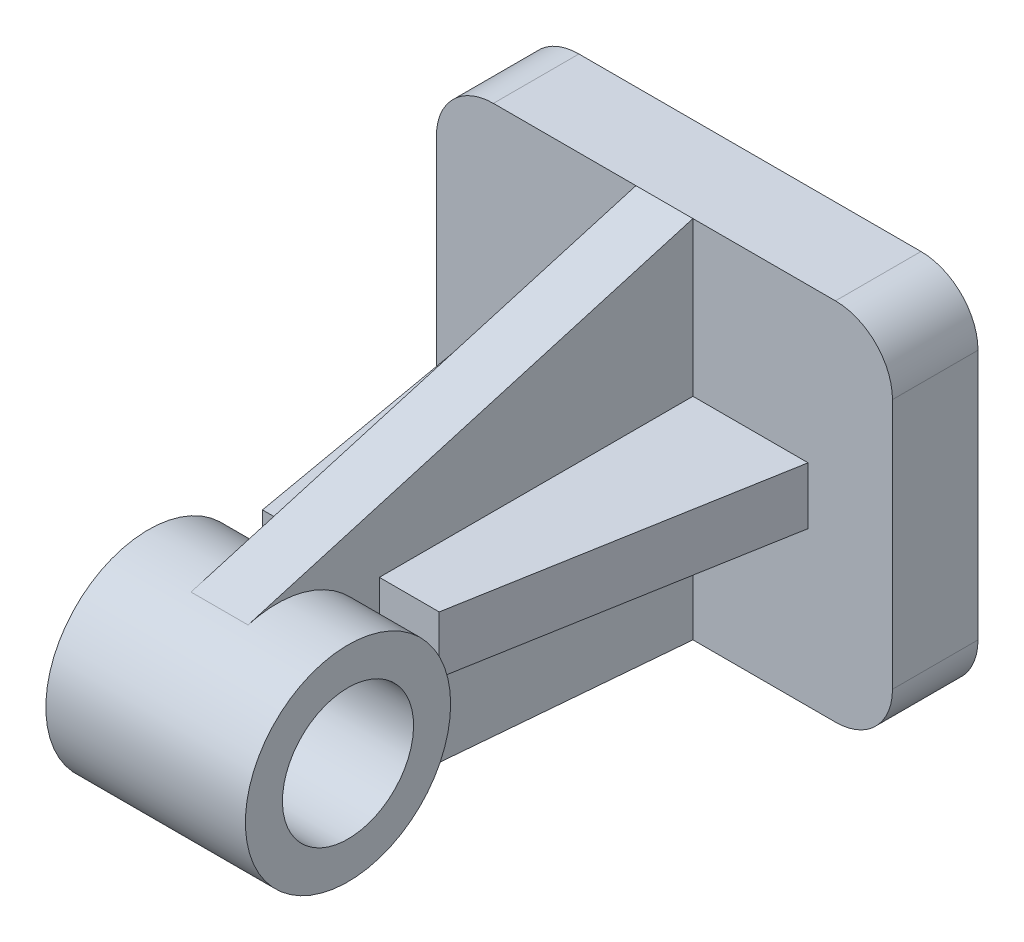
ISO-10303-21;
HEADER;
FILE_DESCRIPTION(('STEP AP214'),'2;1');
FILE_NAME('part.step','',(''),(''),'','','');
FILE_SCHEMA(('AUTOMOTIVE_DESIGN { 1 0 10303 214 1 1 1 1 }'));
ENDSEC;
DATA;
#1=APPLICATION_CONTEXT('core data for automotive mechanical design processes');
#2=APPLICATION_PROTOCOL_DEFINITION('international standard','automotive_design',2000,#1);
#3=PRODUCT_CONTEXT('',#1,'mechanical');
#4=PRODUCT('Part','Part','',(#3));
#5=PRODUCT_RELATED_PRODUCT_CATEGORY('part','',(#4));
#6=PRODUCT_DEFINITION_FORMATION('','',#4);
#7=PRODUCT_DEFINITION_CONTEXT('part definition',#1,'design');
#8=PRODUCT_DEFINITION('design','',#6,#7);
#9=PRODUCT_DEFINITION_SHAPE('','',#8);
#10=(LENGTH_UNIT() NAMED_UNIT(*) SI_UNIT(.MILLI.,.METRE.));
#11=(NAMED_UNIT(*) PLANE_ANGLE_UNIT() SI_UNIT($,.RADIAN.));
#12=(NAMED_UNIT(*) SI_UNIT($,.STERADIAN.) SOLID_ANGLE_UNIT());
#13=UNCERTAINTY_MEASURE_WITH_UNIT(LENGTH_MEASURE(1.E-05),#10,'distance_accuracy_value','');
#14=(GEOMETRIC_REPRESENTATION_CONTEXT(3) GLOBAL_UNCERTAINTY_ASSIGNED_CONTEXT((#13)) GLOBAL_UNIT_ASSIGNED_CONTEXT((#10,
#11,#12)) REPRESENTATION_CONTEXT('',''));
#15=CARTESIAN_POINT('',(0.,0.,0.));
#16=DIRECTION('',(0.,0.,1.));
#17=DIRECTION('',(1.,0.,0.));
#18=AXIS2_PLACEMENT_3D('',#15,#16,#17);
#19=CARTESIAN_POINT('',(0.,0.,15.));
#20=DIRECTION('',(0.,0.,1.));
#21=DIRECTION('',(1.,0.,0.));
#22=AXIS2_PLACEMENT_3D('',#19,#20,#21);
#23=PLANE('',#22);
#24=DIRECTION('',(0.,-1.,0.));
#25=VECTOR('',#24,1.);
#26=CARTESIAN_POINT('',(25.1979839389654,5.,15.));
#27=LINE('',#26,#25);
#28=CARTESIAN_POINT('',(25.1979839389654,5.,15.));
#29=VERTEX_POINT('',#28);
#30=CARTESIAN_POINT('',(25.1979839389654,-5.,15.));
#31=VERTEX_POINT('',#30);
#32=EDGE_CURVE('E69',#29,#31,#27,.T.);
#33=ORIENTED_EDGE('',*,*,#32,.T.);
#34=DIRECTION('',(-1.,0.,0.));
#35=VECTOR('',#34,1.);
#36=CARTESIAN_POINT('',(-25.1979839389654,-5.,15.));
#37=LINE('',#36,#35);
#38=CARTESIAN_POINT('',(5.,-5.,15.));
#39=VERTEX_POINT('',#38);
#40=EDGE_CURVE('E676',#31,#39,#37,.T.);
#41=ORIENTED_EDGE('',*,*,#40,.T.);
#42=DIRECTION('',(0.,-1.,0.));
#43=VECTOR('',#42,1.);
#44=CARTESIAN_POINT('',(5.,0.,15.));
#45=LINE('',#44,#43);
#46=CARTESIAN_POINT('',(5.,-32.,15.));
#47=VERTEX_POINT('',#46);
#48=EDGE_CURVE('E254',#39,#47,#45,.T.);
#49=ORIENTED_EDGE('',*,*,#48,.T.);
#50=DIRECTION('',(1.,0.,0.));
#51=VECTOR('',#50,1.);
#52=CARTESIAN_POINT('',(-40.,-32.,15.));
#53=LINE('',#52,#51);
#54=CARTESIAN_POINT('',(30.,-32.,15.));
#55=VERTEX_POINT('',#54);
#56=EDGE_CURVE('E305',#47,#55,#53,.T.);
#57=ORIENTED_EDGE('',*,*,#56,.T.);
#58=CARTESIAN_POINT('',(30.,-22.,15.));
#59=DIRECTION('',(0.,0.,1.));
#60=DIRECTION('',(1.,0.,0.));
#61=AXIS2_PLACEMENT_3D('',#58,#59,#60);
#62=CIRCLE('',#61,10.);
#63=CARTESIAN_POINT('',(40.,-22.,15.));
#64=VERTEX_POINT('',#63);
#65=EDGE_CURVE('E352',#55,#64,#62,.T.);
#66=ORIENTED_EDGE('',*,*,#65,.T.);
#67=DIRECTION('',(0.,1.,0.));
#68=VECTOR('',#67,1.);
#69=CARTESIAN_POINT('',(40.,-32.,15.));
#70=LINE('',#69,#68);
#71=CARTESIAN_POINT('',(40.,22.,15.));
#72=VERTEX_POINT('',#71);
#73=EDGE_CURVE('E307',#64,#72,#70,.T.);
#74=ORIENTED_EDGE('',*,*,#73,.T.);
#75=CARTESIAN_POINT('',(30.,22.,15.));
#76=DIRECTION('',(0.,0.,1.));
#77=DIRECTION('',(1.,0.,0.));
#78=AXIS2_PLACEMENT_3D('',#75,#76,#77);
#79=CIRCLE('',#78,10.);
#80=CARTESIAN_POINT('',(30.,32.,15.));
#81=VERTEX_POINT('',#80);
#82=EDGE_CURVE('E362',#72,#81,#79,.T.);
#83=ORIENTED_EDGE('',*,*,#82,.T.);
#84=DIRECTION('',(-1.,0.,0.));
#85=VECTOR('',#84,1.);
#86=CARTESIAN_POINT('',(-40.,32.,15.));
#87=LINE('',#86,#85);
#88=CARTESIAN_POINT('',(5.,32.,15.));
#89=VERTEX_POINT('',#88);
#90=EDGE_CURVE('E291',#81,#89,#87,.T.);
#91=ORIENTED_EDGE('',*,*,#90,.T.);
#92=CARTESIAN_POINT('',(5.,5.,15.));
#93=VERTEX_POINT('',#92);
#94=EDGE_CURVE('E258',#89,#93,#45,.T.);
#95=ORIENTED_EDGE('',*,*,#94,.T.);
#96=DIRECTION('',(-1.,0.,0.));
#97=VECTOR('',#96,1.);
#98=CARTESIAN_POINT('',(-25.1979839389654,5.,15.));
#99=LINE('',#98,#97);
#100=EDGE_CURVE('E74',#29,#93,#99,.T.);
#101=ORIENTED_EDGE('',*,*,#100,.F.);
#102=EDGE_LOOP('',(#33,#41,#49,#57,#66,#74,#83,#91,#95,#101));
#103=FACE_BOUND('',#102,.T.);
#104=ADVANCED_FACE('F52',(#103),#23,.T.);
#105=DIRECTION('',(0.,-1.,0.));
#106=VECTOR('',#105,1.);
#107=CARTESIAN_POINT('',(-5.,0.,15.));
#108=LINE('',#107,#106);
#109=CARTESIAN_POINT('',(-5.,-5.,15.));
#110=VERTEX_POINT('',#109);
#111=CARTESIAN_POINT('',(-5.,-32.,15.));
#112=VERTEX_POINT('',#111);
#113=EDGE_CURVE('E271',#110,#112,#108,.T.);
#114=ORIENTED_EDGE('',*,*,#113,.F.);
#115=CARTESIAN_POINT('',(-25.1979839389654,-5.,15.));
#116=VERTEX_POINT('',#115);
#117=EDGE_CURVE('E680',#110,#116,#37,.T.);
#118=ORIENTED_EDGE('',*,*,#117,.T.);
#119=DIRECTION('',(0.,-1.,0.));
#120=VECTOR('',#119,1.);
#121=CARTESIAN_POINT('',(-25.1979839389654,5.,15.));
#122=LINE('',#121,#120);
#123=CARTESIAN_POINT('',(-25.1979839389654,5.,15.));
#124=VERTEX_POINT('',#123);
#125=EDGE_CURVE('E222',#124,#116,#122,.T.);
#126=ORIENTED_EDGE('',*,*,#125,.F.);
#127=CARTESIAN_POINT('',(-5.,5.,15.));
#128=VERTEX_POINT('',#127);
#129=EDGE_CURVE('E208',#128,#124,#99,.T.);
#130=ORIENTED_EDGE('',*,*,#129,.F.);
#131=CARTESIAN_POINT('',(-5.,32.,15.));
#132=VERTEX_POINT('',#131);
#133=EDGE_CURVE('E275',#132,#128,#108,.T.);
#134=ORIENTED_EDGE('',*,*,#133,.F.);
#135=CARTESIAN_POINT('',(-30.,32.,15.));
#136=VERTEX_POINT('',#135);
#137=EDGE_CURVE('E297',#132,#136,#87,.T.);
#138=ORIENTED_EDGE('',*,*,#137,.T.);
#139=CARTESIAN_POINT('',(-30.,22.,15.));
#140=DIRECTION('',(0.,0.,1.));
#141=DIRECTION('',(1.,0.,0.));
#142=AXIS2_PLACEMENT_3D('',#139,#140,#141);
#143=CIRCLE('',#142,10.);
#144=CARTESIAN_POINT('',(-40.,22.,15.));
#145=VERTEX_POINT('',#144);
#146=EDGE_CURVE('E358',#136,#145,#143,.T.);
#147=ORIENTED_EDGE('',*,*,#146,.T.);
#148=DIRECTION('',(0.,-1.,0.));
#149=VECTOR('',#148,1.);
#150=CARTESIAN_POINT('',(-40.,-32.,15.));
#151=LINE('',#150,#149);
#152=CARTESIAN_POINT('',(-40.,-22.,15.));
#153=VERTEX_POINT('',#152);
#154=EDGE_CURVE('E300',#145,#153,#151,.T.);
#155=ORIENTED_EDGE('',*,*,#154,.T.);
#156=CARTESIAN_POINT('',(-30.,-22.,15.));
#157=DIRECTION('',(0.,0.,1.));
#158=DIRECTION('',(1.,0.,0.));
#159=AXIS2_PLACEMENT_3D('',#156,#157,#158);
#160=CIRCLE('',#159,10.);
#161=CARTESIAN_POINT('',(-30.,-32.,15.));
#162=VERTEX_POINT('',#161);
#163=EDGE_CURVE('E359',#153,#162,#160,.T.);
#164=ORIENTED_EDGE('',*,*,#163,.T.);
#165=EDGE_CURVE('E301',#162,#112,#53,.T.);
#166=ORIENTED_EDGE('',*,*,#165,.T.);
#167=EDGE_LOOP('',(#114,#118,#126,#130,#134,#138,#147,#155,#164,#166));
#168=FACE_BOUND('',#167,.T.);
#169=ADVANCED_FACE('F407',(#168),#23,.T.);
#170=CARTESIAN_POINT('',(5.,0.,0.));
#171=DIRECTION('',(1.,0.,0.));
#172=DIRECTION('',(0.,0.,-1.));
#173=AXIS2_PLACEMENT_3D('',#170,#171,#172);
#174=PLANE('',#173);
#175=DIRECTION('',(0.,1.,0.));
#176=VECTOR('',#175,1.);
#177=CARTESIAN_POINT('',(5.,0.,70.));
#178=LINE('',#177,#176);
#179=CARTESIAN_POINT('',(5.,-5.,70.));
#180=VERTEX_POINT('',#179);
#181=CARTESIAN_POINT('',(5.,5.,70.));
#182=VERTEX_POINT('',#181);
#183=EDGE_CURVE('E230',#180,#182,#178,.T.);
#184=ORIENTED_EDGE('',*,*,#183,.T.);
#185=DIRECTION('',(0.,0.,-1.));
#186=VECTOR('',#185,1.);
#187=CARTESIAN_POINT('',(5.,5.,0.));
#188=LINE('',#187,#186);
#189=EDGE_CURVE('E192',#182,#93,#188,.T.);
#190=ORIENTED_EDGE('',*,*,#189,.T.);
#191=ORIENTED_EDGE('',*,*,#94,.F.);
#192=DIRECTION('',(0.,0.279527499455133,-0.960137686505618));
#193=VECTOR('',#192,1.);
#194=CARTESIAN_POINT('',(5.,33.5254333651708,9.76035071680426));
#195=LINE('',#194,#193);
#196=CARTESIAN_POINT('',(5.,9.28247835710112,93.0314949901924));
#197=VERTEX_POINT('',#196);
#198=EDGE_CURVE('E259',#197,#89,#195,.T.);
#199=ORIENTED_EDGE('',*,*,#198,.F.);
#200=CARTESIAN_POINT('',(5.,-8.,88.));
#201=DIRECTION('',(1.,0.,0.));
#202=DIRECTION('',(0.,0.,-1.));
#203=AXIS2_PLACEMENT_3D('',#200,#201,#202);
#204=CIRCLE('',#203,18.);
#205=CARTESIAN_POINT('',(5.,-25.940694883688,89.4599544823084));
#206=VERTEX_POINT('',#205);
#207=EDGE_CURVE('E250',#206,#197,#204,.T.);
#208=ORIENTED_EDGE('',*,*,#207,.F.);
#209=DIRECTION('',(0.,0.0811085823504653,0.996705271315998));
#210=VECTOR('',#209,1.);
#211=CARTESIAN_POINT('',(5.,-33.0021050054763,2.68560228244918));
#212=LINE('',#211,#210);
#213=EDGE_CURVE('E247',#47,#206,#212,.T.);
#214=ORIENTED_EDGE('',*,*,#213,.F.);
#215=ORIENTED_EDGE('',*,*,#48,.F.);
#216=DIRECTION('',(0.,0.,-1.));
#217=VECTOR('',#216,1.);
#218=CARTESIAN_POINT('',(5.,-5.,0.));
#219=LINE('',#218,#217);
#220=EDGE_CURVE('E214',#180,#39,#219,.T.);
#221=ORIENTED_EDGE('',*,*,#220,.F.);
#222=EDGE_LOOP('',(#184,#190,#191,#199,#208,#214,#215,#221));
#223=FACE_BOUND('',#222,.T.);
#224=ADVANCED_FACE('F472',(#223),#174,.T.);
#225=CARTESIAN_POINT('',(-5.,0.,0.));
#226=DIRECTION('',(1.,0.,0.));
#227=DIRECTION('',(0.,0.,-1.));
#228=AXIS2_PLACEMENT_3D('',#225,#226,#227);
#229=PLANE('',#228);
#230=DIRECTION('',(0.,0.,-1.));
#231=VECTOR('',#230,1.);
#232=CARTESIAN_POINT('',(-5.,5.,0.));
#233=LINE('',#232,#231);
#234=CARTESIAN_POINT('',(-5.,5.,70.));
#235=VERTEX_POINT('',#234);
#236=EDGE_CURVE('E12',#235,#128,#233,.T.);
#237=ORIENTED_EDGE('',*,*,#236,.F.);
#238=DIRECTION('',(0.,1.,0.));
#239=VECTOR('',#238,1.);
#240=CARTESIAN_POINT('',(-5.,0.,70.));
#241=LINE('',#240,#239);
#242=CARTESIAN_POINT('',(-5.,-5.,70.));
#243=VERTEX_POINT('',#242);
#244=EDGE_CURVE('E65',#243,#235,#241,.T.);
#245=ORIENTED_EDGE('',*,*,#244,.F.);
#246=DIRECTION('',(0.,0.,-1.));
#247=VECTOR('',#246,1.);
#248=CARTESIAN_POINT('',(-5.,-5.,0.));
#249=LINE('',#248,#247);
#250=EDGE_CURVE('E379',#243,#110,#249,.T.);
#251=ORIENTED_EDGE('',*,*,#250,.T.);
#252=ORIENTED_EDGE('',*,*,#113,.T.);
#253=DIRECTION('',(0.,0.0811085823504653,0.996705271315998));
#254=VECTOR('',#253,1.);
#255=CARTESIAN_POINT('',(-5.,-33.0021050054763,2.68560228244918));
#256=LINE('',#255,#254);
#257=CARTESIAN_POINT('',(-5.,-25.940694883688,89.4599544823084));
#258=VERTEX_POINT('',#257);
#259=EDGE_CURVE('E270',#112,#258,#256,.T.);
#260=ORIENTED_EDGE('',*,*,#259,.T.);
#261=CARTESIAN_POINT('',(-5.,-8.,88.));
#262=DIRECTION('',(1.,0.,0.));
#263=DIRECTION('',(0.,0.,-1.));
#264=AXIS2_PLACEMENT_3D('',#261,#262,#263);
#265=CIRCLE('',#264,18.);
#266=CARTESIAN_POINT('',(-5.,9.28247835710112,93.0314949901924));
#267=VERTEX_POINT('',#266);
#268=EDGE_CURVE('E242',#258,#267,#265,.T.);
#269=ORIENTED_EDGE('',*,*,#268,.T.);
#270=DIRECTION('',(0.,0.279527499455133,-0.960137686505618));
#271=VECTOR('',#270,1.);
#272=CARTESIAN_POINT('',(-5.,33.5254333651708,9.76035071680426));
#273=LINE('',#272,#271);
#274=EDGE_CURVE('E253',#267,#132,#273,.T.);
#275=ORIENTED_EDGE('',*,*,#274,.T.);
#276=ORIENTED_EDGE('',*,*,#133,.T.);
#277=EDGE_LOOP('',(#237,#245,#251,#252,#260,#269,#275,#276));
#278=FACE_BOUND('',#277,.T.);
#279=ADVANCED_FACE('F405',(#278),#229,.F.);
#280=CARTESIAN_POINT('',(-40.,32.,15.));
#281=DIRECTION('',(0.,-1.,0.));
#282=DIRECTION('',(0.,0.,-1.));
#283=AXIS2_PLACEMENT_3D('',#280,#281,#282);
#284=PLANE('',#283);
#285=ORIENTED_EDGE('',*,*,#90,.F.);
#286=DIRECTION('',(0.,0.,-1.));
#287=VECTOR('',#286,1.);
#288=CARTESIAN_POINT('',(30.,32.,15.));
#289=LINE('',#288,#287);
#290=CARTESIAN_POINT('',(30.,32.,0.));
#291=VERTEX_POINT('',#290);
#292=EDGE_CURVE('E329',#81,#291,#289,.T.);
#293=ORIENTED_EDGE('',*,*,#292,.T.);
#294=DIRECTION('',(-1.,0.,0.));
#295=VECTOR('',#294,1.);
#296=CARTESIAN_POINT('',(-40.,32.,0.));
#297=LINE('',#296,#295);
#298=CARTESIAN_POINT('',(-30.,32.,0.));
#299=VERTEX_POINT('',#298);
#300=EDGE_CURVE('E295',#291,#299,#297,.T.);
#301=ORIENTED_EDGE('',*,*,#300,.T.);
#302=DIRECTION('',(0.,0.,-1.));
#303=VECTOR('',#302,1.);
#304=CARTESIAN_POINT('',(-30.,32.,15.));
#305=LINE('',#304,#303);
#306=EDGE_CURVE('E313',#299,#136,#305,.F.);
#307=ORIENTED_EDGE('',*,*,#306,.T.);
#308=ORIENTED_EDGE('',*,*,#137,.F.);
#309=DIRECTION('',(-1.,0.,0.));
#310=VECTOR('',#309,1.);
#311=CARTESIAN_POINT('',(5.,32.,15.));
#312=LINE('',#311,#310);
#313=EDGE_CURVE('E281',#89,#132,#312,.T.);
#314=ORIENTED_EDGE('',*,*,#313,.F.);
#315=EDGE_LOOP('',(#285,#293,#301,#307,#308,#314));
#316=FACE_BOUND('',#315,.T.);
#317=ADVANCED_FACE('F411',(#316),#284,.F.);
#318=CARTESIAN_POINT('',(-40.,-32.,15.));
#319=DIRECTION('',(1.,0.,0.));
#320=DIRECTION('',(0.,0.,-1.));
#321=AXIS2_PLACEMENT_3D('',#318,#319,#320);
#322=PLANE('',#321);
#323=DIRECTION('',(0.,-1.,0.));
#324=VECTOR('',#323,1.);
#325=CARTESIAN_POINT('',(-40.,-32.,0.));
#326=LINE('',#325,#324);
#327=CARTESIAN_POINT('',(-40.,22.,0.));
#328=VERTEX_POINT('',#327);
#329=CARTESIAN_POINT('',(-40.,-22.,0.));
#330=VERTEX_POINT('',#329);
#331=EDGE_CURVE('E312',#328,#330,#326,.T.);
#332=ORIENTED_EDGE('',*,*,#331,.T.);
#333=DIRECTION('',(0.,0.,-1.));
#334=VECTOR('',#333,1.);
#335=CARTESIAN_POINT('',(-40.,-22.,15.));
#336=LINE('',#335,#334);
#337=EDGE_CURVE('E380',#330,#153,#336,.F.);
#338=ORIENTED_EDGE('',*,*,#337,.T.);
#339=ORIENTED_EDGE('',*,*,#154,.F.);
#340=DIRECTION('',(0.,0.,-1.));
#341=VECTOR('',#340,1.);
#342=CARTESIAN_POINT('',(-40.,22.,15.));
#343=LINE('',#342,#341);
#344=EDGE_CURVE('E373',#145,#328,#343,.T.);
#345=ORIENTED_EDGE('',*,*,#344,.T.);
#346=EDGE_LOOP('',(#332,#338,#339,#345));
#347=FACE_BOUND('',#346,.T.);
#348=ADVANCED_FACE('F457',(#347),#322,.F.);
#349=CARTESIAN_POINT('',(-40.,-32.,15.));
#350=DIRECTION('',(0.,1.,0.));
#351=DIRECTION('',(0.,0.,1.));
#352=AXIS2_PLACEMENT_3D('',#349,#350,#351);
#353=PLANE('',#352);
#354=ORIENTED_EDGE('',*,*,#165,.F.);
#355=DIRECTION('',(0.,0.,-1.));
#356=VECTOR('',#355,1.);
#357=CARTESIAN_POINT('',(-30.,-32.,15.));
#358=LINE('',#357,#356);
#359=CARTESIAN_POINT('',(-30.,-32.,0.));
#360=VERTEX_POINT('',#359);
#361=EDGE_CURVE('E369',#162,#360,#358,.T.);
#362=ORIENTED_EDGE('',*,*,#361,.T.);
#363=DIRECTION('',(1.,0.,0.));
#364=VECTOR('',#363,1.);
#365=CARTESIAN_POINT('',(-40.,-32.,0.));
#366=LINE('',#365,#364);
#367=CARTESIAN_POINT('',(30.,-32.,0.));
#368=VERTEX_POINT('',#367);
#369=EDGE_CURVE('E317',#360,#368,#366,.T.);
#370=ORIENTED_EDGE('',*,*,#369,.T.);
#371=DIRECTION('',(0.,0.,-1.));
#372=VECTOR('',#371,1.);
#373=CARTESIAN_POINT('',(30.,-32.,15.));
#374=LINE('',#373,#372);
#375=EDGE_CURVE('E364',#368,#55,#374,.F.);
#376=ORIENTED_EDGE('',*,*,#375,.T.);
#377=ORIENTED_EDGE('',*,*,#56,.F.);
#378=DIRECTION('',(-1.,0.,0.));
#379=VECTOR('',#378,1.);
#380=CARTESIAN_POINT('',(5.,-32.,15.));
#381=LINE('',#380,#379);
#382=EDGE_CURVE('E283',#47,#112,#381,.T.);
#383=ORIENTED_EDGE('',*,*,#382,.T.);
#384=EDGE_LOOP('',(#354,#362,#370,#376,#377,#383));
#385=FACE_BOUND('',#384,.T.);
#386=ADVANCED_FACE('F430',(#385),#353,.F.);
#387=CARTESIAN_POINT('',(40.,-32.,15.));
#388=DIRECTION('',(-1.,0.,0.));
#389=DIRECTION('',(0.,0.,1.));
#390=AXIS2_PLACEMENT_3D('',#387,#388,#389);
#391=PLANE('',#390);
#392=DIRECTION('',(0.,1.,0.));
#393=VECTOR('',#392,1.);
#394=CARTESIAN_POINT('',(40.,-32.,0.));
#395=LINE('',#394,#393);
#396=CARTESIAN_POINT('',(40.,-22.,0.));
#397=VERTEX_POINT('',#396);
#398=CARTESIAN_POINT('',(40.,22.,0.));
#399=VERTEX_POINT('',#398);
#400=EDGE_CURVE('E323',#397,#399,#395,.T.);
#401=ORIENTED_EDGE('',*,*,#400,.T.);
#402=DIRECTION('',(0.,0.,-1.));
#403=VECTOR('',#402,1.);
#404=CARTESIAN_POINT('',(40.,22.,15.));
#405=LINE('',#404,#403);
#406=EDGE_CURVE('E348',#399,#72,#405,.F.);
#407=ORIENTED_EDGE('',*,*,#406,.T.);
#408=ORIENTED_EDGE('',*,*,#73,.F.);
#409=DIRECTION('',(0.,0.,-1.));
#410=VECTOR('',#409,1.);
#411=CARTESIAN_POINT('',(40.,-22.,15.));
#412=LINE('',#411,#410);
#413=EDGE_CURVE('E347',#64,#397,#412,.T.);
#414=ORIENTED_EDGE('',*,*,#413,.T.);
#415=EDGE_LOOP('',(#401,#407,#408,#414));
#416=FACE_BOUND('',#415,.T.);
#417=ADVANCED_FACE('F446',(#416),#391,.F.);
#418=CARTESIAN_POINT('',(0.,0.,0.));
#419=DIRECTION('',(0.,0.,1.));
#420=DIRECTION('',(1.,0.,0.));
#421=AXIS2_PLACEMENT_3D('',#418,#419,#420);
#422=PLANE('',#421);
#423=ORIENTED_EDGE('',*,*,#300,.F.);
#424=CARTESIAN_POINT('',(30.,22.,0.));
#425=DIRECTION('',(0.,0.,1.));
#426=DIRECTION('',(1.,0.,0.));
#427=AXIS2_PLACEMENT_3D('',#424,#425,#426);
#428=CIRCLE('',#427,10.);
#429=EDGE_CURVE('E341',#291,#399,#428,.F.);
#430=ORIENTED_EDGE('',*,*,#429,.T.);
#431=ORIENTED_EDGE('',*,*,#400,.F.);
#432=CARTESIAN_POINT('',(30.,-22.,0.));
#433=DIRECTION('',(0.,0.,1.));
#434=DIRECTION('',(1.,0.,0.));
#435=AXIS2_PLACEMENT_3D('',#432,#433,#434);
#436=CIRCLE('',#435,10.);
#437=EDGE_CURVE('E331',#397,#368,#436,.F.);
#438=ORIENTED_EDGE('',*,*,#437,.T.);
#439=ORIENTED_EDGE('',*,*,#369,.F.);
#440=CARTESIAN_POINT('',(-30.,-22.,0.));
#441=DIRECTION('',(0.,0.,1.));
#442=DIRECTION('',(1.,0.,0.));
#443=AXIS2_PLACEMENT_3D('',#440,#441,#442);
#444=CIRCLE('',#443,10.);
#445=EDGE_CURVE('E339',#360,#330,#444,.F.);
#446=ORIENTED_EDGE('',*,*,#445,.T.);
#447=ORIENTED_EDGE('',*,*,#331,.F.);
#448=CARTESIAN_POINT('',(-30.,22.,0.));
#449=DIRECTION('',(0.,0.,1.));
#450=DIRECTION('',(1.,0.,0.));
#451=AXIS2_PLACEMENT_3D('',#448,#449,#450);
#452=CIRCLE('',#451,10.);
#453=EDGE_CURVE('E340',#328,#299,#452,.F.);
#454=ORIENTED_EDGE('',*,*,#453,.T.);
#455=EDGE_LOOP('',(#423,#430,#431,#438,#439,#446,#447,#454));
#456=FACE_BOUND('',#455,.T.);
#457=ADVANCED_FACE('F437',(#456),#422,.F.);
#458=CARTESIAN_POINT('',(30.,22.,15.));
#459=DIRECTION('',(0.,0.,-1.));
#460=DIRECTION('',(-1.,0.,0.));
#461=AXIS2_PLACEMENT_3D('',#458,#459,#460);
#462=CYLINDRICAL_SURFACE('',#461,10.);
#463=ORIENTED_EDGE('',*,*,#82,.F.);
#464=ORIENTED_EDGE('',*,*,#406,.F.);
#465=ORIENTED_EDGE('',*,*,#429,.F.);
#466=ORIENTED_EDGE('',*,*,#292,.F.);
#467=EDGE_LOOP('',(#463,#464,#465,#466));
#468=FACE_BOUND('',#467,.T.);
#469=ADVANCED_FACE('F453',(#468),#462,.T.);
#470=CARTESIAN_POINT('',(-30.,-22.,15.));
#471=DIRECTION('',(0.,0.,-1.));
#472=DIRECTION('',(-1.,0.,0.));
#473=AXIS2_PLACEMENT_3D('',#470,#471,#472);
#474=CYLINDRICAL_SURFACE('',#473,10.);
#475=ORIENTED_EDGE('',*,*,#163,.F.);
#476=ORIENTED_EDGE('',*,*,#337,.F.);
#477=ORIENTED_EDGE('',*,*,#445,.F.);
#478=ORIENTED_EDGE('',*,*,#361,.F.);
#479=EDGE_LOOP('',(#475,#476,#477,#478));
#480=FACE_BOUND('',#479,.T.);
#481=ADVANCED_FACE('F433',(#480),#474,.T.);
#482=CARTESIAN_POINT('',(-30.,22.,15.));
#483=DIRECTION('',(0.,0.,-1.));
#484=DIRECTION('',(-1.,0.,0.));
#485=AXIS2_PLACEMENT_3D('',#482,#483,#484);
#486=CYLINDRICAL_SURFACE('',#485,10.);
#487=ORIENTED_EDGE('',*,*,#146,.F.);
#488=ORIENTED_EDGE('',*,*,#306,.F.);
#489=ORIENTED_EDGE('',*,*,#453,.F.);
#490=ORIENTED_EDGE('',*,*,#344,.F.);
#491=EDGE_LOOP('',(#487,#488,#489,#490));
#492=FACE_BOUND('',#491,.T.);
#493=ADVANCED_FACE('F454',(#492),#486,.T.);
#494=CARTESIAN_POINT('',(30.,-22.,15.));
#495=DIRECTION('',(0.,0.,-1.));
#496=DIRECTION('',(-1.,0.,0.));
#497=AXIS2_PLACEMENT_3D('',#494,#495,#496);
#498=CYLINDRICAL_SURFACE('',#497,10.);
#499=ORIENTED_EDGE('',*,*,#65,.F.);
#500=ORIENTED_EDGE('',*,*,#375,.F.);
#501=ORIENTED_EDGE('',*,*,#437,.F.);
#502=ORIENTED_EDGE('',*,*,#413,.F.);
#503=EDGE_LOOP('',(#499,#500,#501,#502));
#504=FACE_BOUND('',#503,.T.);
#505=ADVANCED_FACE('F54',(#504),#498,.T.);
#506=CARTESIAN_POINT('',(5.,-33.0021050054763,2.68560228244918));
#507=DIRECTION('',(0.,-0.996705271315998,0.0811085823504652));
#508=DIRECTION('',(0.,-0.0811085823504652,-0.996705271315998));
#509=AXIS2_PLACEMENT_3D('',#506,#507,#508);
#510=PLANE('',#509);
#511=ORIENTED_EDGE('',*,*,#259,.F.);
#512=ORIENTED_EDGE('',*,*,#382,.F.);
#513=ORIENTED_EDGE('',*,*,#213,.T.);
#514=DIRECTION('',(-1.,0.,0.));
#515=VECTOR('',#514,1.);
#516=CARTESIAN_POINT('',(5.,-25.940694883688,89.4599544823084));
#517=LINE('',#516,#515);
#518=EDGE_CURVE('E286',#206,#258,#517,.T.);
#519=ORIENTED_EDGE('',*,*,#518,.T.);
#520=EDGE_LOOP('',(#511,#512,#513,#519));
#521=FACE_BOUND('',#520,.T.);
#522=ADVANCED_FACE('F421',(#521),#510,.T.);
#523=CARTESIAN_POINT('',(5.,33.5254333651708,9.76035071680426));
#524=DIRECTION('',(0.,0.960137686505618,0.279527499455133));
#525=DIRECTION('',(0.,-0.279527499455133,0.960137686505618));
#526=AXIS2_PLACEMENT_3D('',#523,#524,#525);
#527=PLANE('',#526);
#528=ORIENTED_EDGE('',*,*,#274,.F.);
#529=DIRECTION('',(-1.,0.,0.));
#530=VECTOR('',#529,1.);
#531=CARTESIAN_POINT('',(5.,9.28247835710112,93.0314949901924));
#532=LINE('',#531,#530);
#533=EDGE_CURVE('E263',#197,#267,#532,.T.);
#534=ORIENTED_EDGE('',*,*,#533,.F.);
#535=ORIENTED_EDGE('',*,*,#198,.T.);
#536=ORIENTED_EDGE('',*,*,#313,.T.);
#537=EDGE_LOOP('',(#528,#534,#535,#536));
#538=FACE_BOUND('',#537,.T.);
#539=ADVANCED_FACE('F530',(#538),#527,.T.);
#540=CARTESIAN_POINT('',(17.5,-8.,88.));
#541=DIRECTION('',(1.,0.,0.));
#542=DIRECTION('',(0.,0.,-1.));
#543=AXIS2_PLACEMENT_3D('',#540,#541,#542);
#544=PLANE('',#543);
#545=CARTESIAN_POINT('',(17.5,-8.,88.));
#546=DIRECTION('',(1.,0.,0.));
#547=DIRECTION('',(0.,0.,-1.));
#548=AXIS2_PLACEMENT_3D('',#545,#546,#547);
#549=CIRCLE('',#548,18.);
#550=CARTESIAN_POINT('',(17.5,-8.,70.));
#551=VERTEX_POINT('',#550);
#552=EDGE_CURVE('E239',#551,#551,#549,.T.);
#553=ORIENTED_EDGE('',*,*,#552,.T.);
#554=EDGE_LOOP('',(#553));
#555=FACE_BOUND('',#554,.T.);
#556=CARTESIAN_POINT('',(17.5,-8.,88.));
#557=DIRECTION('',(1.,0.,0.));
#558=DIRECTION('',(0.,1.,0.));
#559=AXIS2_PLACEMENT_3D('',#556,#557,#558);
#560=CIRCLE('',#559,11.5);
#561=CARTESIAN_POINT('',(17.5,3.5,88.));
#562=VERTEX_POINT('',#561);
#563=EDGE_CURVE('E233',#562,#562,#560,.T.);
#564=ORIENTED_EDGE('',*,*,#563,.F.);
#565=EDGE_LOOP('',(#564));
#566=FACE_BOUND('',#565,.T.);
#567=ADVANCED_FACE('F540',(#555,#566),#544,.T.);
#568=CARTESIAN_POINT('',(-17.5,-8.,88.));
#569=DIRECTION('',(1.,0.,0.));
#570=DIRECTION('',(0.,0.,-1.));
#571=AXIS2_PLACEMENT_3D('',#568,#569,#570);
#572=PLANE('',#571);
#573=CARTESIAN_POINT('',(-17.5,-8.,88.));
#574=DIRECTION('',(1.,0.,0.));
#575=DIRECTION('',(0.,0.,-1.));
#576=AXIS2_PLACEMENT_3D('',#573,#574,#575);
#577=CIRCLE('',#576,18.);
#578=CARTESIAN_POINT('',(-17.5,-8.,70.));
#579=VERTEX_POINT('',#578);
#580=EDGE_CURVE('E232',#579,#579,#577,.T.);
#581=ORIENTED_EDGE('',*,*,#580,.F.);
#582=EDGE_LOOP('',(#581));
#583=FACE_BOUND('',#582,.T.);
#584=CARTESIAN_POINT('',(-17.5,-8.,88.));
#585=DIRECTION('',(1.,0.,0.));
#586=DIRECTION('',(0.,1.,0.));
#587=AXIS2_PLACEMENT_3D('',#584,#585,#586);
#588=CIRCLE('',#587,11.5);
#589=CARTESIAN_POINT('',(-17.5,3.5,88.));
#590=VERTEX_POINT('',#589);
#591=EDGE_CURVE('E229',#590,#590,#588,.T.);
#592=ORIENTED_EDGE('',*,*,#591,.T.);
#593=EDGE_LOOP('',(#592));
#594=FACE_BOUND('',#593,.T.);
#595=ADVANCED_FACE('F546',(#583,#594),#572,.F.);
#596=CARTESIAN_POINT('',(17.5,-8.,88.));
#597=DIRECTION('',(-1.,0.,0.));
#598=DIRECTION('',(0.,0.,1.));
#599=AXIS2_PLACEMENT_3D('',#596,#597,#598);
#600=CYLINDRICAL_SURFACE('',#599,18.);
#601=ORIENTED_EDGE('',*,*,#518,.F.);
#602=ORIENTED_EDGE('',*,*,#207,.T.);
#603=ORIENTED_EDGE('',*,*,#533,.T.);
#604=ORIENTED_EDGE('',*,*,#268,.F.);
#605=EDGE_LOOP('',(#601,#602,#603,#604));
#606=FACE_BOUND('',#605,.T.);
#607=ORIENTED_EDGE('',*,*,#552,.F.);
#608=EDGE_LOOP('',(#607));
#609=FACE_BOUND('',#608,.T.);
#610=ORIENTED_EDGE('',*,*,#580,.T.);
#611=EDGE_LOOP('',(#610));
#612=FACE_BOUND('',#611,.T.);
#613=ADVANCED_FACE('F554',(#606,#609,#612),#600,.T.);
#614=CARTESIAN_POINT('',(17.5,-8.,88.));
#615=DIRECTION('',(-1.,0.,0.));
#616=DIRECTION('',(0.,0.,1.));
#617=AXIS2_PLACEMENT_3D('',#614,#615,#616);
#618=CYLINDRICAL_SURFACE('',#617,11.5);
#619=ORIENTED_EDGE('',*,*,#563,.T.);
#620=EDGE_LOOP('',(#619));
#621=FACE_BOUND('',#620,.T.);
#622=ORIENTED_EDGE('',*,*,#591,.F.);
#623=EDGE_LOOP('',(#622));
#624=FACE_BOUND('',#623,.T.);
#625=ADVANCED_FACE('F559',(#621,#624),#618,.F.);
#626=CARTESIAN_POINT('',(0.,5.,0.));
#627=DIRECTION('',(0.,-1.,0.));
#628=DIRECTION('',(0.,0.,-1.));
#629=AXIS2_PLACEMENT_3D('',#626,#627,#628);
#630=PLANE('',#629);
#631=DIRECTION('',(1.,0.,0.));
#632=VECTOR('',#631,1.);
#633=CARTESIAN_POINT('',(15.5,5.,70.));
#634=LINE('',#633,#632);
#635=CARTESIAN_POINT('',(-15.5,5.,70.));
#636=VERTEX_POINT('',#635);
#637=EDGE_CURVE('E199',#636,#235,#634,.T.);
#638=ORIENTED_EDGE('',*,*,#637,.T.);
#639=ORIENTED_EDGE('',*,*,#236,.T.);
#640=ORIENTED_EDGE('',*,*,#129,.T.);
#641=DIRECTION('',(0.173648177666927,0.,0.984807753012209));
#642=VECTOR('',#641,1.);
#643=CARTESIAN_POINT('',(-15.5,5.,70.));
#644=LINE('',#643,#642);
#645=EDGE_CURVE('E399',#124,#636,#644,.T.);
#646=ORIENTED_EDGE('',*,*,#645,.T.);
#647=EDGE_LOOP('',(#638,#639,#640,#646));
#648=FACE_BOUND('',#647,.T.);
#649=ADVANCED_FACE('F398',(#648),#630,.F.);
#650=CARTESIAN_POINT('',(0.,-5.,0.));
#651=DIRECTION('',(0.,-1.,0.));
#652=DIRECTION('',(0.,0.,-1.));
#653=AXIS2_PLACEMENT_3D('',#650,#651,#652);
#654=PLANE('',#653);
#655=ORIENTED_EDGE('',*,*,#250,.F.);
#656=DIRECTION('',(1.,0.,0.));
#657=VECTOR('',#656,1.);
#658=CARTESIAN_POINT('',(15.5,-5.,70.));
#659=LINE('',#658,#657);
#660=CARTESIAN_POINT('',(-15.5,-5.,70.));
#661=VERTEX_POINT('',#660);
#662=EDGE_CURVE('E395',#661,#243,#659,.T.);
#663=ORIENTED_EDGE('',*,*,#662,.F.);
#664=DIRECTION('',(0.173648177666927,0.,0.984807753012209));
#665=VECTOR('',#664,1.);
#666=CARTESIAN_POINT('',(-15.5,-5.,70.));
#667=LINE('',#666,#665);
#668=EDGE_CURVE('E203',#116,#661,#667,.T.);
#669=ORIENTED_EDGE('',*,*,#668,.F.);
#670=ORIENTED_EDGE('',*,*,#117,.F.);
#671=EDGE_LOOP('',(#655,#663,#669,#670));
#672=FACE_BOUND('',#671,.T.);
#673=ADVANCED_FACE('F604',(#672),#654,.T.);
#674=CARTESIAN_POINT('',(15.5,5.,70.));
#675=DIRECTION('',(0.,0.,-1.));
#676=DIRECTION('',(-1.,0.,0.));
#677=AXIS2_PLACEMENT_3D('',#674,#675,#676);
#678=PLANE('',#677);
#679=ORIENTED_EDGE('',*,*,#662,.T.);
#680=ORIENTED_EDGE('',*,*,#244,.T.);
#681=ORIENTED_EDGE('',*,*,#637,.F.);
#682=DIRECTION('',(0.,-1.,0.));
#683=VECTOR('',#682,1.);
#684=CARTESIAN_POINT('',(-15.5,5.,70.));
#685=LINE('',#684,#683);
#686=EDGE_CURVE('E682',#636,#661,#685,.T.);
#687=ORIENTED_EDGE('',*,*,#686,.T.);
#688=EDGE_LOOP('',(#679,#680,#681,#687));
#689=FACE_BOUND('',#688,.T.);
#690=ADVANCED_FACE('F386',(#689),#678,.F.);
#691=CARTESIAN_POINT('',(-15.5,5.,70.));
#692=DIRECTION('',(0.984807753012209,0.,-0.173648177666927));
#693=DIRECTION('',(-0.173648177666927,0.,-0.984807753012209));
#694=AXIS2_PLACEMENT_3D('',#691,#692,#693);
#695=PLANE('',#694);
#696=ORIENTED_EDGE('',*,*,#668,.T.);
#697=ORIENTED_EDGE('',*,*,#686,.F.);
#698=ORIENTED_EDGE('',*,*,#645,.F.);
#699=ORIENTED_EDGE('',*,*,#125,.T.);
#700=EDGE_LOOP('',(#696,#697,#698,#699));
#701=FACE_BOUND('',#700,.T.);
#702=ADVANCED_FACE('F625',(#701),#695,.F.);
#703=ORIENTED_EDGE('',*,*,#183,.F.);
#704=CARTESIAN_POINT('',(15.5,-5.,70.));
#705=VERTEX_POINT('',#704);
#706=EDGE_CURVE('E215',#180,#705,#659,.T.);
#707=ORIENTED_EDGE('',*,*,#706,.T.);
#708=DIRECTION('',(0.,-1.,0.));
#709=VECTOR('',#708,1.);
#710=CARTESIAN_POINT('',(15.5,5.,70.));
#711=LINE('',#710,#709);
#712=CARTESIAN_POINT('',(15.5,5.,70.));
#713=VERTEX_POINT('',#712);
#714=EDGE_CURVE('E206',#713,#705,#711,.T.);
#715=ORIENTED_EDGE('',*,*,#714,.F.);
#716=EDGE_CURVE('E193',#182,#713,#634,.T.);
#717=ORIENTED_EDGE('',*,*,#716,.F.);
#718=EDGE_LOOP('',(#703,#707,#715,#717));
#719=FACE_BOUND('',#718,.T.);
#720=ADVANCED_FACE('F209',(#719),#678,.F.);
#721=CARTESIAN_POINT('',(15.5,5.,70.));
#722=DIRECTION('',(-0.984807753012209,0.,-0.173648177666927));
#723=DIRECTION('',(-0.173648177666927,0.,0.984807753012209));
#724=AXIS2_PLACEMENT_3D('',#721,#722,#723);
#725=PLANE('',#724);
#726=DIRECTION('',(0.173648177666927,0.,-0.984807753012209));
#727=VECTOR('',#726,1.);
#728=CARTESIAN_POINT('',(15.5,-5.,70.));
#729=LINE('',#728,#727);
#730=EDGE_CURVE('E667',#705,#31,#729,.T.);
#731=ORIENTED_EDGE('',*,*,#730,.T.);
#732=ORIENTED_EDGE('',*,*,#32,.F.);
#733=DIRECTION('',(0.173648177666927,0.,-0.984807753012209));
#734=VECTOR('',#733,1.);
#735=CARTESIAN_POINT('',(15.5,5.,70.));
#736=LINE('',#735,#734);
#737=EDGE_CURVE('E194',#713,#29,#736,.T.);
#738=ORIENTED_EDGE('',*,*,#737,.F.);
#739=ORIENTED_EDGE('',*,*,#714,.T.);
#740=EDGE_LOOP('',(#731,#732,#738,#739));
#741=FACE_BOUND('',#740,.T.);
#742=ADVANCED_FACE('F202',(#741),#725,.F.);
#743=ORIENTED_EDGE('',*,*,#189,.F.);
#744=ORIENTED_EDGE('',*,*,#716,.T.);
#745=ORIENTED_EDGE('',*,*,#737,.T.);
#746=ORIENTED_EDGE('',*,*,#100,.T.);
#747=EDGE_LOOP('',(#743,#744,#745,#746));
#748=FACE_BOUND('',#747,.T.);
#749=ADVANCED_FACE('F191',(#748),#630,.F.);
#750=ORIENTED_EDGE('',*,*,#706,.F.);
#751=ORIENTED_EDGE('',*,*,#220,.T.);
#752=ORIENTED_EDGE('',*,*,#40,.F.);
#753=ORIENTED_EDGE('',*,*,#730,.F.);
#754=EDGE_LOOP('',(#750,#751,#752,#753));
#755=FACE_BOUND('',#754,.T.);
#756=ADVANCED_FACE('F614',(#755),#654,.T.);
#757=CLOSED_SHELL('',(#104,#169,#224,#279,#317,#348,#386,#417,#457,#469,#481,#493,#505,#522,
#539,#567,#595,#613,#625,#649,#673,#690,#702,#720,#742,#749,#756));
#758=MANIFOLD_SOLID_BREP('B2',#757);
#759=ADVANCED_BREP_SHAPE_REPRESENTATION('',(#18,#758),#14);
#760=SHAPE_DEFINITION_REPRESENTATION(#9,#759);
ENDSEC;
END-ISO-10303-21;
